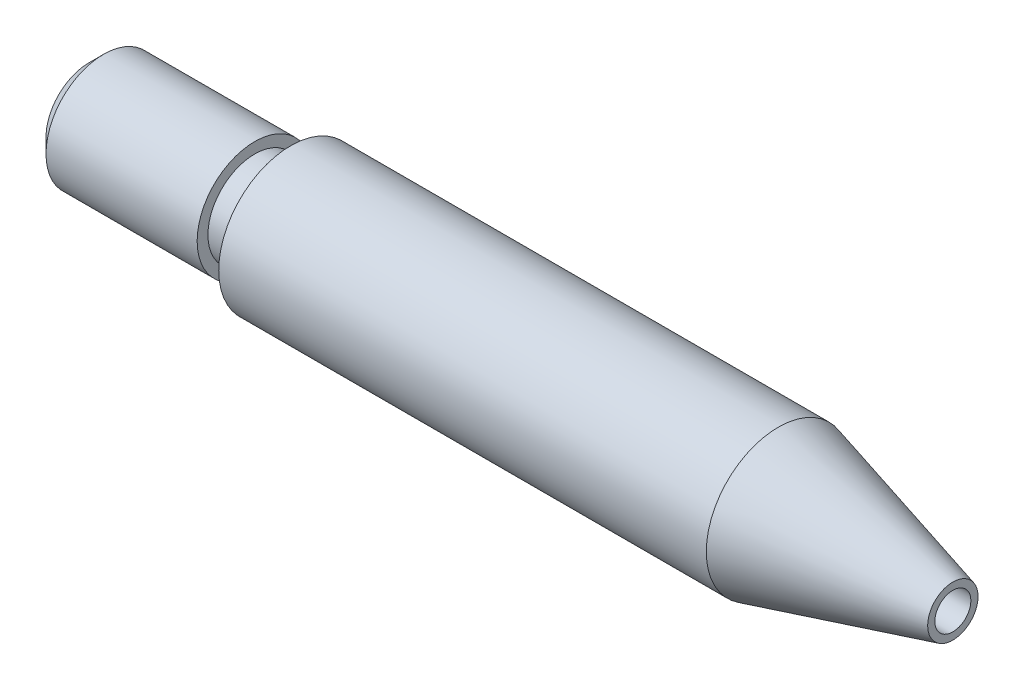
ISO-10303-21;
HEADER;
FILE_DESCRIPTION(('STEP AP214'),'2;1');
FILE_NAME('part.step','',(''),(''),'','','');
FILE_SCHEMA(('AUTOMOTIVE_DESIGN { 1 0 10303 214 1 1 1 1 }'));
ENDSEC;
DATA;
#1=APPLICATION_CONTEXT('core data for automotive mechanical design processes');
#2=APPLICATION_PROTOCOL_DEFINITION('international standard','automotive_design',2000,#1);
#3=PRODUCT_CONTEXT('',#1,'mechanical');
#4=PRODUCT('Part','Part','',(#3));
#5=PRODUCT_RELATED_PRODUCT_CATEGORY('part','',(#4));
#6=PRODUCT_DEFINITION_FORMATION('','',#4);
#7=PRODUCT_DEFINITION_CONTEXT('part definition',#1,'design');
#8=PRODUCT_DEFINITION('design','',#6,#7);
#9=PRODUCT_DEFINITION_SHAPE('','',#8);
#10=(LENGTH_UNIT() NAMED_UNIT(*) SI_UNIT(.MILLI.,.METRE.));
#11=(NAMED_UNIT(*) PLANE_ANGLE_UNIT() SI_UNIT($,.RADIAN.));
#12=(NAMED_UNIT(*) SI_UNIT($,.STERADIAN.) SOLID_ANGLE_UNIT());
#13=UNCERTAINTY_MEASURE_WITH_UNIT(LENGTH_MEASURE(1.E-05),#10,'distance_accuracy_value','');
#14=(GEOMETRIC_REPRESENTATION_CONTEXT(3) GLOBAL_UNCERTAINTY_ASSIGNED_CONTEXT((#13)) GLOBAL_UNIT_ASSIGNED_CONTEXT((#10,
#11,#12)) REPRESENTATION_CONTEXT('',''));
#15=CARTESIAN_POINT('',(0.,0.,0.));
#16=DIRECTION('',(0.,0.,1.));
#17=DIRECTION('',(1.,0.,0.));
#18=AXIS2_PLACEMENT_3D('',#15,#16,#17);
#19=CARTESIAN_POINT('',(10.9530248345,1.75,0.));
#20=DIRECTION('',(-1.,0.,0.));
#21=DIRECTION('',(0.,0.,1.));
#22=AXIS2_PLACEMENT_3D('',#19,#20,#21);
#23=PLANE('',#22);
#24=CARTESIAN_POINT('',(10.9530248345,0.,0.));
#25=DIRECTION('',(1.,0.,0.));
#26=DIRECTION('',(0.,0.,-1.));
#27=AXIS2_PLACEMENT_3D('',#24,#25,#26);
#28=CIRCLE('',#27,1.25);
#29=CARTESIAN_POINT('',(10.9530248345,0.,-1.25));
#30=VERTEX_POINT('',#29);
#31=EDGE_CURVE('E58',#30,#30,#28,.T.);
#32=ORIENTED_EDGE('',*,*,#31,.F.);
#33=EDGE_LOOP('',(#32));
#34=FACE_BOUND('',#33,.T.);
#35=CARTESIAN_POINT('',(10.9530248345,0.,0.));
#36=DIRECTION('',(-1.,0.,0.));
#37=DIRECTION('',(0.,0.,1.));
#38=AXIS2_PLACEMENT_3D('',#35,#36,#37);
#39=CIRCLE('',#38,1.75);
#40=CARTESIAN_POINT('',(10.9530248345,0.,1.75));
#41=VERTEX_POINT('',#40);
#42=EDGE_CURVE('E71',#41,#41,#39,.T.);
#43=ORIENTED_EDGE('',*,*,#42,.F.);
#44=EDGE_LOOP('',(#43));
#45=FACE_BOUND('',#44,.T.);
#46=ADVANCED_FACE('F37',(#34,#45),#23,.F.);
#47=CARTESIAN_POINT('',(-49.0469751655,0.,0.));
#48=DIRECTION('',(1.,0.,0.));
#49=DIRECTION('',(0.,0.,-1.));
#50=AXIS2_PLACEMENT_3D('',#47,#48,#49);
#51=PLANE('',#50);
#52=CARTESIAN_POINT('',(-49.0469751655,0.,0.));
#53=DIRECTION('',(1.,0.,0.));
#54=DIRECTION('',(0.,0.,-1.));
#55=AXIS2_PLACEMENT_3D('',#52,#53,#54);
#56=CIRCLE('',#55,2.99999999999998);
#57=CARTESIAN_POINT('',(-49.0469751655,0.,-2.99999999999998));
#58=VERTEX_POINT('',#57);
#59=EDGE_CURVE('E44',#58,#58,#56,.F.);
#60=ORIENTED_EDGE('',*,*,#59,.T.);
#61=EDGE_LOOP('',(#60));
#62=FACE_BOUND('',#61,.T.);
#63=CARTESIAN_POINT('',(-49.0469751655,0.,0.));
#64=DIRECTION('',(-1.,0.,0.));
#65=DIRECTION('',(0.,0.,1.));
#66=AXIS2_PLACEMENT_3D('',#63,#64,#65);
#67=CIRCLE('',#66,1.75);
#68=CARTESIAN_POINT('',(-49.0469751655,0.,1.75));
#69=VERTEX_POINT('',#68);
#70=EDGE_CURVE('E57',#69,#69,#67,.T.);
#71=ORIENTED_EDGE('',*,*,#70,.F.);
#72=EDGE_LOOP('',(#71));
#73=FACE_BOUND('',#72,.T.);
#74=ADVANCED_FACE('F86',(#62,#73),#51,.F.);
#75=CARTESIAN_POINT('',(-15.3901869022237,0.,0.));
#76=DIRECTION('',(-1.,0.,0.));
#77=DIRECTION('',(0.,0.,1.));
#78=AXIS2_PLACEMENT_3D('',#75,#76,#77);
#79=CYLINDRICAL_SURFACE('',#78,3.99999999999999);
#80=CARTESIAN_POINT('',(-48.0469751655,0.,0.));
#81=DIRECTION('',(1.,0.,0.));
#82=DIRECTION('',(0.,0.,-1.));
#83=AXIS2_PLACEMENT_3D('',#80,#81,#82);
#84=CIRCLE('',#83,3.99999999999999);
#85=CARTESIAN_POINT('',(-48.0469751655,0.,-3.99999999999999));
#86=VERTEX_POINT('',#85);
#87=EDGE_CURVE('E10',#86,#86,#84,.T.);
#88=ORIENTED_EDGE('',*,*,#87,.T.);
#89=EDGE_LOOP('',(#88));
#90=FACE_BOUND('',#89,.T.);
#91=CARTESIAN_POINT('',(-37.5469751655,0.,0.));
#92=DIRECTION('',(-1.,0.,0.));
#93=DIRECTION('',(0.,0.,1.));
#94=AXIS2_PLACEMENT_3D('',#91,#92,#93);
#95=CIRCLE('',#94,3.99999999999999);
#96=CARTESIAN_POINT('',(-37.5469751655,0.,3.99999999999999));
#97=VERTEX_POINT('',#96);
#98=EDGE_CURVE('E48',#97,#97,#95,.T.);
#99=ORIENTED_EDGE('',*,*,#98,.T.);
#100=EDGE_LOOP('',(#99));
#101=FACE_BOUND('',#100,.T.);
#102=ADVANCED_FACE('F118',(#90,#101),#79,.T.);
#103=CARTESIAN_POINT('',(-37.5469751655,3.99999999999999,0.));
#104=DIRECTION('',(-1.,0.,0.));
#105=DIRECTION('',(0.,0.,1.));
#106=AXIS2_PLACEMENT_3D('',#103,#104,#105);
#107=PLANE('',#106);
#108=ORIENTED_EDGE('',*,*,#98,.F.);
#109=EDGE_LOOP('',(#108));
#110=FACE_BOUND('',#109,.T.);
#111=CARTESIAN_POINT('',(-37.5469751655,0.,0.));
#112=DIRECTION('',(-1.,0.,0.));
#113=DIRECTION('',(0.,0.,1.));
#114=AXIS2_PLACEMENT_3D('',#111,#112,#113);
#115=CIRCLE('',#114,3.25);
#116=CARTESIAN_POINT('',(-37.5469751655,0.,3.25));
#117=VERTEX_POINT('',#116);
#118=EDGE_CURVE('E52',#117,#117,#115,.T.);
#119=ORIENTED_EDGE('',*,*,#118,.T.);
#120=EDGE_LOOP('',(#119));
#121=FACE_BOUND('',#120,.T.);
#122=ADVANCED_FACE('F114',(#110,#121),#107,.F.);
#123=CARTESIAN_POINT('',(-15.3901869022237,0.,0.));
#124=DIRECTION('',(-1.,0.,0.));
#125=DIRECTION('',(0.,0.,1.));
#126=AXIS2_PLACEMENT_3D('',#123,#124,#125);
#127=CYLINDRICAL_SURFACE('',#126,3.25);
#128=ORIENTED_EDGE('',*,*,#118,.F.);
#129=EDGE_LOOP('',(#128));
#130=FACE_BOUND('',#129,.T.);
#131=CARTESIAN_POINT('',(-35.0469751655,0.,0.));
#132=DIRECTION('',(-1.,0.,0.));
#133=DIRECTION('',(0.,0.,1.));
#134=AXIS2_PLACEMENT_3D('',#131,#132,#133);
#135=CIRCLE('',#134,3.25);
#136=CARTESIAN_POINT('',(-35.0469751655,0.,3.25));
#137=VERTEX_POINT('',#136);
#138=EDGE_CURVE('E62',#137,#137,#135,.T.);
#139=ORIENTED_EDGE('',*,*,#138,.T.);
#140=EDGE_LOOP('',(#139));
#141=FACE_BOUND('',#140,.T.);
#142=ADVANCED_FACE('F110',(#130,#141),#127,.T.);
#143=CARTESIAN_POINT('',(-35.0469751655,3.25,0.));
#144=DIRECTION('',(1.,0.,0.));
#145=DIRECTION('',(0.,0.,-1.));
#146=AXIS2_PLACEMENT_3D('',#143,#144,#145);
#147=PLANE('',#146);
#148=ORIENTED_EDGE('',*,*,#138,.F.);
#149=EDGE_LOOP('',(#148));
#150=FACE_BOUND('',#149,.T.);
#151=CARTESIAN_POINT('',(-35.0469751655,0.,0.));
#152=DIRECTION('',(-1.,0.,0.));
#153=DIRECTION('',(0.,0.,1.));
#154=AXIS2_PLACEMENT_3D('',#151,#152,#153);
#155=CIRCLE('',#154,4.99999999999999);
#156=CARTESIAN_POINT('',(-35.0469751655,0.,4.99999999999999));
#157=VERTEX_POINT('',#156);
#158=EDGE_CURVE('E65',#157,#157,#155,.T.);
#159=ORIENTED_EDGE('',*,*,#158,.T.);
#160=EDGE_LOOP('',(#159));
#161=FACE_BOUND('',#160,.T.);
#162=ADVANCED_FACE('F102',(#150,#161),#147,.F.);
#163=CARTESIAN_POINT('',(-15.3901869022237,0.,0.));
#164=DIRECTION('',(-1.,0.,0.));
#165=DIRECTION('',(0.,0.,1.));
#166=AXIS2_PLACEMENT_3D('',#163,#164,#165);
#167=CYLINDRICAL_SURFACE('',#166,5.);
#168=ORIENTED_EDGE('',*,*,#158,.F.);
#169=EDGE_LOOP('',(#168));
#170=FACE_BOUND('',#169,.T.);
#171=CARTESIAN_POINT('',(-1.17614029009922,0.,0.));
#172=DIRECTION('',(-1.,0.,0.));
#173=DIRECTION('',(0.,0.,1.));
#174=AXIS2_PLACEMENT_3D('',#171,#172,#173);
#175=CIRCLE('',#174,5.);
#176=CARTESIAN_POINT('',(-1.17614029009922,0.,5.));
#177=VERTEX_POINT('',#176);
#178=EDGE_CURVE('E68',#177,#177,#175,.T.);
#179=ORIENTED_EDGE('',*,*,#178,.T.);
#180=EDGE_LOOP('',(#179));
#181=FACE_BOUND('',#180,.T.);
#182=ADVANCED_FACE('F92',(#170,#181),#167,.T.);
#183=CARTESIAN_POINT('',(10.9530248345,0.,0.));
#184=DIRECTION('',(-1.,0.,0.));
#185=DIRECTION('',(0.,0.,1.));
#186=AXIS2_PLACEMENT_3D('',#183,#184,#185);
#187=CONICAL_SURFACE('',#186,1.75,0.261799387799143);
#188=ORIENTED_EDGE('',*,*,#178,.F.);
#189=EDGE_LOOP('',(#188));
#190=FACE_BOUND('',#189,.T.);
#191=ORIENTED_EDGE('',*,*,#42,.T.);
#192=EDGE_LOOP('',(#191));
#193=FACE_BOUND('',#192,.T.);
#194=ADVANCED_FACE('F89',(#190,#193),#187,.T.);
#195=CARTESIAN_POINT('',(6.95302483449996,0.,0.));
#196=DIRECTION('',(-1.,0.,0.));
#197=DIRECTION('',(0.,0.,1.));
#198=AXIS2_PLACEMENT_3D('',#195,#196,#197);
#199=CYLINDRICAL_SURFACE('',#198,1.75);
#200=CARTESIAN_POINT('',(6.95302483449996,0.,0.));
#201=DIRECTION('',(-1.,0.,0.));
#202=DIRECTION('',(0.,0.,1.));
#203=AXIS2_PLACEMENT_3D('',#200,#201,#202);
#204=CIRCLE('',#203,1.75);
#205=CARTESIAN_POINT('',(6.95302483449996,0.,1.75));
#206=VERTEX_POINT('',#205);
#207=EDGE_CURVE('E74',#206,#206,#204,.T.);
#208=ORIENTED_EDGE('',*,*,#207,.F.);
#209=EDGE_LOOP('',(#208));
#210=FACE_BOUND('',#209,.T.);
#211=ORIENTED_EDGE('',*,*,#70,.T.);
#212=EDGE_LOOP('',(#211));
#213=FACE_BOUND('',#212,.T.);
#214=ADVANCED_FACE('F91',(#210,#213),#199,.F.);
#215=CARTESIAN_POINT('',(6.95302483449996,0.,0.));
#216=DIRECTION('',(-1.,0.,0.));
#217=DIRECTION('',(0.,0.,1.));
#218=AXIS2_PLACEMENT_3D('',#215,#216,#217);
#219=PLANE('',#218);
#220=CARTESIAN_POINT('',(6.95302483449996,0.,0.));
#221=DIRECTION('',(-1.,0.,0.));
#222=DIRECTION('',(0.,0.,1.));
#223=AXIS2_PLACEMENT_3D('',#220,#221,#222);
#224=CIRCLE('',#223,1.25);
#225=CARTESIAN_POINT('',(6.95302483449996,0.,1.25));
#226=VERTEX_POINT('',#225);
#227=EDGE_CURVE('E55',#226,#226,#224,.T.);
#228=ORIENTED_EDGE('',*,*,#227,.F.);
#229=EDGE_LOOP('',(#228));
#230=FACE_BOUND('',#229,.T.);
#231=ORIENTED_EDGE('',*,*,#207,.T.);
#232=EDGE_LOOP('',(#231));
#233=FACE_BOUND('',#232,.T.);
#234=ADVANCED_FACE('F99',(#230,#233),#219,.T.);
#235=CARTESIAN_POINT('',(-49.0469751655,0.,0.));
#236=DIRECTION('',(1.,0.,0.));
#237=DIRECTION('',(0.,0.,-1.));
#238=AXIS2_PLACEMENT_3D('',#235,#236,#237);
#239=CYLINDRICAL_SURFACE('',#238,1.25);
#240=ORIENTED_EDGE('',*,*,#227,.T.);
#241=EDGE_LOOP('',(#240));
#242=FACE_BOUND('',#241,.T.);
#243=ORIENTED_EDGE('',*,*,#31,.T.);
#244=EDGE_LOOP('',(#243));
#245=FACE_BOUND('',#244,.T.);
#246=ADVANCED_FACE('F82',(#242,#245),#239,.F.);
#247=CARTESIAN_POINT('',(-49.0469751655,0.,0.));
#248=DIRECTION('',(1.,0.,0.));
#249=DIRECTION('',(0.,0.,-1.));
#250=AXIS2_PLACEMENT_3D('',#247,#248,#249);
#251=CONICAL_SURFACE('',#250,2.99999999999998,0.785398163397447);
#252=ORIENTED_EDGE('',*,*,#87,.F.);
#253=EDGE_LOOP('',(#252));
#254=FACE_BOUND('',#253,.T.);
#255=ORIENTED_EDGE('',*,*,#59,.F.);
#256=EDGE_LOOP('',(#255));
#257=FACE_BOUND('',#256,.T.);
#258=ADVANCED_FACE('F39',(#254,#257),#251,.T.);
#259=CLOSED_SHELL('',(#46,#74,#102,#122,#142,#162,#182,#194,#214,#234,#246,#258));
#260=MANIFOLD_SOLID_BREP('B2',#259);
#261=ADVANCED_BREP_SHAPE_REPRESENTATION('',(#18,#260),#14);
#262=SHAPE_DEFINITION_REPRESENTATION(#9,#261);
ENDSEC;
END-ISO-10303-21;
